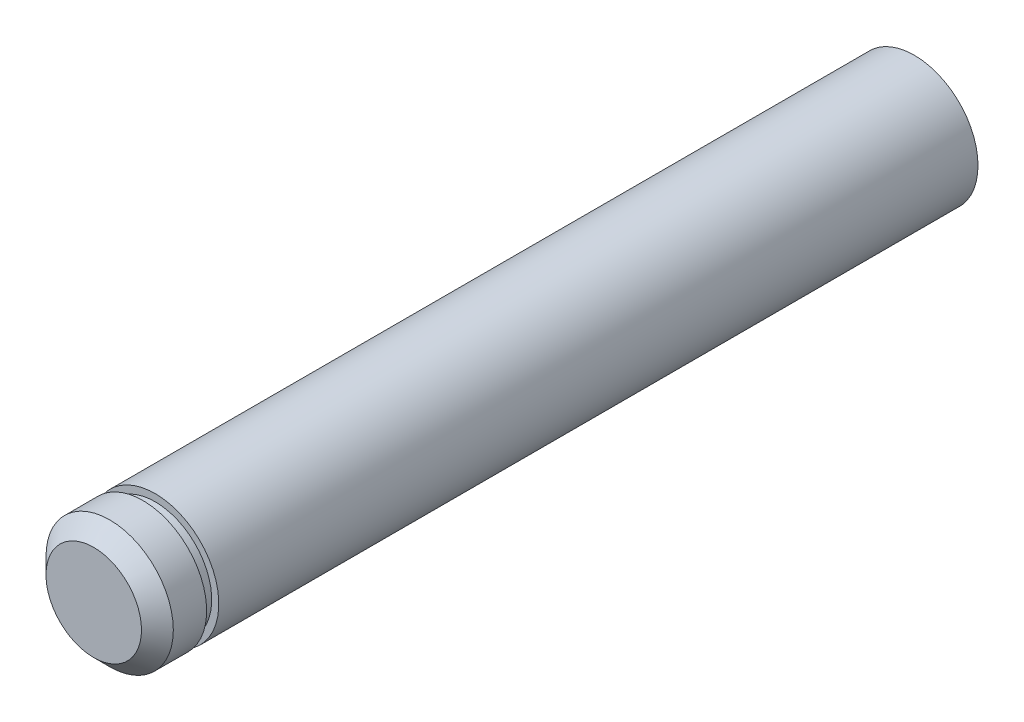
ISO-10303-21;
HEADER;
FILE_DESCRIPTION(('STEP AP214'),'2;1');
FILE_NAME('part.step','',(''),(''),'','','');
FILE_SCHEMA(('AUTOMOTIVE_DESIGN { 1 0 10303 214 1 1 1 1 }'));
ENDSEC;
DATA;
#1=APPLICATION_CONTEXT('core data for automotive mechanical design processes');
#2=APPLICATION_PROTOCOL_DEFINITION('international standard','automotive_design',2000,#1);
#3=PRODUCT_CONTEXT('',#1,'mechanical');
#4=PRODUCT('Part','Part','',(#3));
#5=PRODUCT_RELATED_PRODUCT_CATEGORY('part','',(#4));
#6=PRODUCT_DEFINITION_FORMATION('','',#4);
#7=PRODUCT_DEFINITION_CONTEXT('part definition',#1,'design');
#8=PRODUCT_DEFINITION('design','',#6,#7);
#9=PRODUCT_DEFINITION_SHAPE('','',#8);
#10=(LENGTH_UNIT() NAMED_UNIT(*) SI_UNIT(.MILLI.,.METRE.));
#11=(NAMED_UNIT(*) PLANE_ANGLE_UNIT() SI_UNIT($,.RADIAN.));
#12=(NAMED_UNIT(*) SI_UNIT($,.STERADIAN.) SOLID_ANGLE_UNIT());
#13=UNCERTAINTY_MEASURE_WITH_UNIT(LENGTH_MEASURE(1.E-05),#10,'distance_accuracy_value','');
#14=(GEOMETRIC_REPRESENTATION_CONTEXT(3) GLOBAL_UNCERTAINTY_ASSIGNED_CONTEXT((#13)) GLOBAL_UNIT_ASSIGNED_CONTEXT((#10,
#11,#12)) REPRESENTATION_CONTEXT('',''));
#15=CARTESIAN_POINT('',(0.,0.,0.));
#16=DIRECTION('',(0.,0.,1.));
#17=DIRECTION('',(1.,0.,0.));
#18=AXIS2_PLACEMENT_3D('',#15,#16,#17);
#19=CARTESIAN_POINT('',(0.,0.,51.562));
#20=DIRECTION('',(0.,0.,-1.));
#21=DIRECTION('',(-1.,0.,0.));
#22=AXIS2_PLACEMENT_3D('',#19,#20,#21);
#23=CYLINDRICAL_SURFACE('',#22,4.);
#24=CARTESIAN_POINT('',(0.,0.,0.));
#25=DIRECTION('',(0.,0.,1.));
#26=DIRECTION('',(1.,0.,0.));
#27=AXIS2_PLACEMENT_3D('',#24,#25,#26);
#28=CIRCLE('',#27,4.);
#29=CARTESIAN_POINT('',(4.,0.,0.));
#30=VERTEX_POINT('',#29);
#31=EDGE_CURVE('E85',#30,#30,#28,.T.);
#32=ORIENTED_EDGE('',*,*,#31,.T.);
#33=EDGE_LOOP('',(#32));
#34=FACE_BOUND('',#33,.T.);
#35=CARTESIAN_POINT('',(0.,0.,47.705));
#36=DIRECTION('',(0.,0.,-1.));
#37=DIRECTION('',(-1.,0.,0.));
#38=AXIS2_PLACEMENT_3D('',#35,#36,#37);
#39=CIRCLE('',#38,4.);
#40=CARTESIAN_POINT('',(-4.,0.,47.705));
#41=VERTEX_POINT('',#40);
#42=EDGE_CURVE('E82',#41,#41,#39,.T.);
#43=ORIENTED_EDGE('',*,*,#42,.T.);
#44=EDGE_LOOP('',(#43));
#45=FACE_BOUND('',#44,.T.);
#46=ADVANCED_FACE('F49',(#34,#45),#23,.T.);
#47=CARTESIAN_POINT('',(0.,0.,0.));
#48=DIRECTION('',(0.,0.,1.));
#49=DIRECTION('',(1.,0.,0.));
#50=AXIS2_PLACEMENT_3D('',#47,#48,#49);
#51=PLANE('',#50);
#52=CARTESIAN_POINT('',(0.,0.,0.));
#53=DIRECTION('',(0.,0.,-1.));
#54=DIRECTION('',(-1.,0.,0.));
#55=AXIS2_PLACEMENT_3D('',#52,#53,#54);
#56=CIRCLE('',#55,2.01929999999999);
#57=CARTESIAN_POINT('',(-2.01929999999999,0.,0.));
#58=VERTEX_POINT('',#57);
#59=EDGE_CURVE('E69',#58,#58,#56,.T.);
#60=ORIENTED_EDGE('',*,*,#59,.F.);
#61=EDGE_LOOP('',(#60));
#62=FACE_BOUND('',#61,.T.);
#63=ORIENTED_EDGE('',*,*,#31,.F.);
#64=EDGE_LOOP('',(#63));
#65=FACE_BOUND('',#64,.T.);
#66=ADVANCED_FACE('F101',(#62,#65),#51,.F.);
#67=CARTESIAN_POINT('',(3.55600000000001,0.,47.705));
#68=DIRECTION('',(0.,0.,1.));
#69=DIRECTION('',(1.,0.,0.));
#70=AXIS2_PLACEMENT_3D('',#67,#68,#69);
#71=PLANE('',#70);
#72=CARTESIAN_POINT('',(0.,0.,47.705));
#73=DIRECTION('',(0.,0.,-1.));
#74=DIRECTION('',(-1.,0.,0.));
#75=AXIS2_PLACEMENT_3D('',#72,#73,#74);
#76=CIRCLE('',#75,3.55600000000001);
#77=CARTESIAN_POINT('',(-3.55600000000001,0.,47.705));
#78=VERTEX_POINT('',#77);
#79=EDGE_CURVE('E68',#78,#78,#76,.T.);
#80=ORIENTED_EDGE('',*,*,#79,.T.);
#81=EDGE_LOOP('',(#80));
#82=FACE_BOUND('',#81,.T.);
#83=ORIENTED_EDGE('',*,*,#42,.F.);
#84=EDGE_LOOP('',(#83));
#85=FACE_BOUND('',#84,.T.);
#86=ADVANCED_FACE('F106',(#82,#85),#71,.T.);
#87=CARTESIAN_POINT('',(3.55600000000001,0.,48.467));
#88=DIRECTION('',(0.,0.,-1.));
#89=DIRECTION('',(-1.,0.,0.));
#90=AXIS2_PLACEMENT_3D('',#87,#88,#89);
#91=PLANE('',#90);
#92=CARTESIAN_POINT('',(0.,0.,48.467));
#93=DIRECTION('',(0.,0.,-1.));
#94=DIRECTION('',(-1.,0.,0.));
#95=AXIS2_PLACEMENT_3D('',#92,#93,#94);
#96=CIRCLE('',#95,4.);
#97=CARTESIAN_POINT('',(-4.,0.,48.467));
#98=VERTEX_POINT('',#97);
#99=EDGE_CURVE('E79',#98,#98,#96,.T.);
#100=ORIENTED_EDGE('',*,*,#99,.T.);
#101=EDGE_LOOP('',(#100));
#102=FACE_BOUND('',#101,.T.);
#103=CARTESIAN_POINT('',(0.,0.,48.467));
#104=DIRECTION('',(0.,0.,-1.));
#105=DIRECTION('',(-1.,0.,0.));
#106=AXIS2_PLACEMENT_3D('',#103,#104,#105);
#107=CIRCLE('',#106,3.55600000000001);
#108=CARTESIAN_POINT('',(-3.55600000000001,0.,48.467));
#109=VERTEX_POINT('',#108);
#110=EDGE_CURVE('E72',#109,#109,#107,.T.);
#111=ORIENTED_EDGE('',*,*,#110,.F.);
#112=EDGE_LOOP('',(#111));
#113=FACE_BOUND('',#112,.T.);
#114=ADVANCED_FACE('F116',(#102,#113),#91,.T.);
#115=CARTESIAN_POINT('',(0.,0.,0.));
#116=DIRECTION('',(0.,0.,-1.));
#117=DIRECTION('',(-1.,0.,0.));
#118=AXIS2_PLACEMENT_3D('',#115,#116,#117);
#119=CYLINDRICAL_SURFACE('',#118,3.55600000000001);
#120=ORIENTED_EDGE('',*,*,#110,.T.);
#121=EDGE_LOOP('',(#120));
#122=FACE_BOUND('',#121,.T.);
#123=ORIENTED_EDGE('',*,*,#79,.F.);
#124=EDGE_LOOP('',(#123));
#125=FACE_BOUND('',#124,.T.);
#126=ADVANCED_FACE('F113',(#122,#125),#119,.T.);
#127=CARTESIAN_POINT('',(0.,0.,51.562));
#128=DIRECTION('',(0.,0.,1.));
#129=DIRECTION('',(1.,0.,0.));
#130=AXIS2_PLACEMENT_3D('',#127,#128,#129);
#131=PLANE('',#130);
#132=CARTESIAN_POINT('',(0.,0.,51.562));
#133=DIRECTION('',(0.,0.,1.));
#134=DIRECTION('',(1.,0.,0.));
#135=AXIS2_PLACEMENT_3D('',#132,#133,#134);
#136=CIRCLE('',#135,3.);
#137=CARTESIAN_POINT('',(3.,0.,51.562));
#138=VERTEX_POINT('',#137);
#139=EDGE_CURVE('E56',#138,#138,#136,.T.);
#140=ORIENTED_EDGE('',*,*,#139,.T.);
#141=EDGE_LOOP('',(#140));
#142=FACE_BOUND('',#141,.T.);
#143=ADVANCED_FACE('F90',(#142),#131,.T.);
#144=CARTESIAN_POINT('',(0.,0.,50.562));
#145=DIRECTION('',(0.,0.,1.));
#146=DIRECTION('',(1.,0.,0.));
#147=AXIS2_PLACEMENT_3D('',#144,#145,#146);
#148=CIRCLE('',#147,4.);
#149=CARTESIAN_POINT('',(4.,0.,50.562));
#150=VERTEX_POINT('',#149);
#151=EDGE_CURVE('E13',#150,#150,#148,.F.);
#152=ORIENTED_EDGE('',*,*,#151,.T.);
#153=EDGE_LOOP('',(#152));
#154=FACE_BOUND('',#153,.T.);
#155=ORIENTED_EDGE('',*,*,#99,.F.);
#156=EDGE_LOOP('',(#155));
#157=FACE_BOUND('',#156,.T.);
#158=ADVANCED_FACE('F93',(#154,#157),#23,.T.);
#159=CARTESIAN_POINT('',(0.,0.,51.562));
#160=DIRECTION('',(0.,0.,-1.));
#161=DIRECTION('',(-1.,0.,0.));
#162=AXIS2_PLACEMENT_3D('',#159,#160,#161);
#163=CONICAL_SURFACE('',#162,3.,0.78539816339745);
#164=ORIENTED_EDGE('',*,*,#151,.F.);
#165=EDGE_LOOP('',(#164));
#166=FACE_BOUND('',#165,.T.);
#167=ORIENTED_EDGE('',*,*,#139,.F.);
#168=EDGE_LOOP('',(#167));
#169=FACE_BOUND('',#168,.T.);
#170=ADVANCED_FACE('F51',(#166,#169),#163,.T.);
#171=CARTESIAN_POINT('',(0.,0.,12.7));
#172=DIRECTION('',(0.,0.,-1.));
#173=DIRECTION('',(-1.,0.,0.));
#174=AXIS2_PLACEMENT_3D('',#171,#172,#173);
#175=CONICAL_SURFACE('',#174,2.01929999999999,1.02974425867665);
#176=CARTESIAN_POINT('',(0.,0.,13.9133178480024));
#177=VERTEX_POINT('',#176);
#178=VERTEX_LOOP('',#177);
#179=FACE_BOUND('',#178,.T.);
#180=CARTESIAN_POINT('',(0.,0.,12.7));
#181=DIRECTION('',(0.,0.,-1.));
#182=DIRECTION('',(-1.,0.,0.));
#183=AXIS2_PLACEMENT_3D('',#180,#181,#182);
#184=CIRCLE('',#183,2.01929999999999);
#185=CARTESIAN_POINT('',(-2.01929999999999,0.,12.7));
#186=VERTEX_POINT('',#185);
#187=EDGE_CURVE('E66',#186,#186,#184,.T.);
#188=ORIENTED_EDGE('',*,*,#187,.T.);
#189=EDGE_LOOP('',(#188));
#190=FACE_BOUND('',#189,.T.);
#191=ADVANCED_FACE('F59',(#179,#190),#175,.F.);
#192=CARTESIAN_POINT('',(0.,0.,0.));
#193=DIRECTION('',(0.,0.,-1.));
#194=DIRECTION('',(-1.,0.,0.));
#195=AXIS2_PLACEMENT_3D('',#192,#193,#194);
#196=CYLINDRICAL_SURFACE('',#195,2.01929999999999);
#197=ORIENTED_EDGE('',*,*,#187,.F.);
#198=EDGE_LOOP('',(#197));
#199=FACE_BOUND('',#198,.T.);
#200=ORIENTED_EDGE('',*,*,#59,.T.);
#201=EDGE_LOOP('',(#200));
#202=FACE_BOUND('',#201,.T.);
#203=ADVANCED_FACE('F62',(#199,#202),#196,.F.);
#204=CLOSED_SHELL('',(#46,#66,#86,#114,#126,#143,#158,#170,#191,#203));
#205=MANIFOLD_SOLID_BREP('B2',#204);
#206=ADVANCED_BREP_SHAPE_REPRESENTATION('',(#18,#205),#14);
#207=SHAPE_DEFINITION_REPRESENTATION(#9,#206);
ENDSEC;
END-ISO-10303-21;
